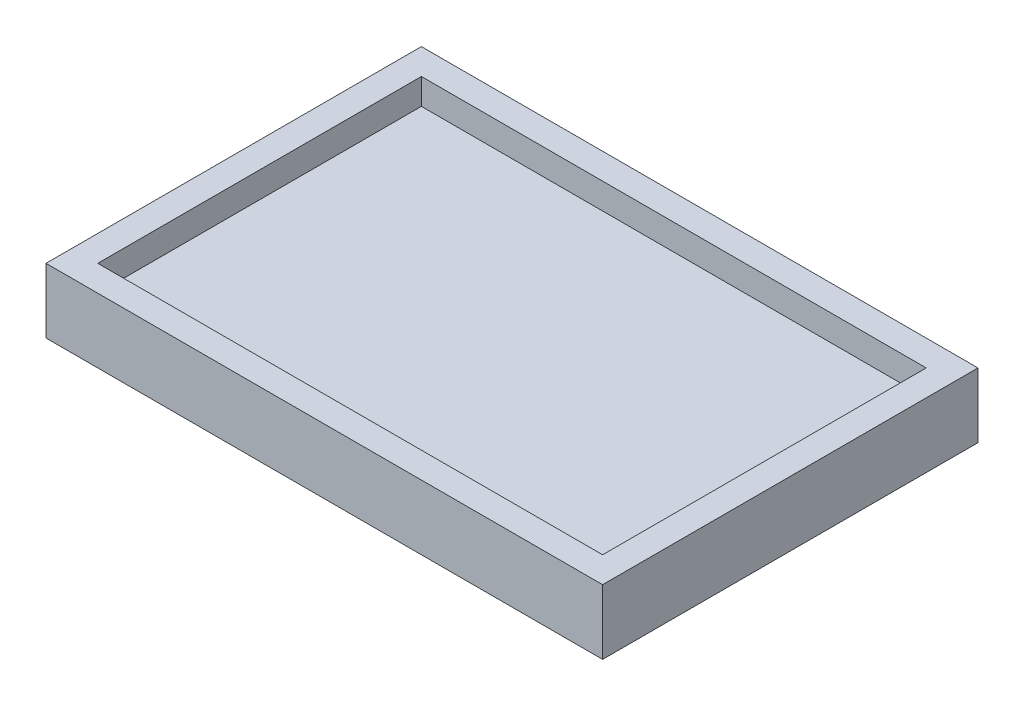
ISO-10303-21;
HEADER;
FILE_DESCRIPTION(('STEP AP214'),'2;1');
FILE_NAME('part.step','',(''),(''),'','','');
FILE_SCHEMA(('AUTOMOTIVE_DESIGN { 1 0 10303 214 1 1 1 1 }'));
ENDSEC;
DATA;
#1=APPLICATION_CONTEXT('core data for automotive mechanical design processes');
#2=APPLICATION_PROTOCOL_DEFINITION('international standard','automotive_design',2000,#1);
#3=PRODUCT_CONTEXT('',#1,'mechanical');
#4=PRODUCT('Part','Part','',(#3));
#5=PRODUCT_RELATED_PRODUCT_CATEGORY('part','',(#4));
#6=PRODUCT_DEFINITION_FORMATION('','',#4);
#7=PRODUCT_DEFINITION_CONTEXT('part definition',#1,'design');
#8=PRODUCT_DEFINITION('design','',#6,#7);
#9=PRODUCT_DEFINITION_SHAPE('','',#8);
#10=(LENGTH_UNIT() NAMED_UNIT(*) SI_UNIT(.MILLI.,.METRE.));
#11=(NAMED_UNIT(*) PLANE_ANGLE_UNIT() SI_UNIT($,.RADIAN.));
#12=(NAMED_UNIT(*) SI_UNIT($,.STERADIAN.) SOLID_ANGLE_UNIT());
#13=UNCERTAINTY_MEASURE_WITH_UNIT(LENGTH_MEASURE(1.E-05),#10,'distance_accuracy_value','');
#14=(GEOMETRIC_REPRESENTATION_CONTEXT(3) GLOBAL_UNCERTAINTY_ASSIGNED_CONTEXT((#13)) GLOBAL_UNIT_ASSIGNED_CONTEXT((#10,
#11,#12)) REPRESENTATION_CONTEXT('',''));
#15=CARTESIAN_POINT('',(0.,0.,0.));
#16=DIRECTION('',(0.,0.,1.));
#17=DIRECTION('',(1.,0.,0.));
#18=AXIS2_PLACEMENT_3D('',#15,#16,#17);
#19=CARTESIAN_POINT('',(-21.5,5.,-14.5));
#20=DIRECTION('',(1.,0.,0.));
#21=DIRECTION('',(0.,0.,-1.));
#22=AXIS2_PLACEMENT_3D('',#19,#20,#21);
#23=PLANE('',#22);
#24=DIRECTION('',(0.,0.,1.));
#25=VECTOR('',#24,1.);
#26=CARTESIAN_POINT('',(-21.5,0.,-14.5));
#27=LINE('',#26,#25);
#28=CARTESIAN_POINT('',(-21.5,0.,-14.5));
#29=VERTEX_POINT('',#28);
#30=CARTESIAN_POINT('',(-21.5,0.,14.5));
#31=VERTEX_POINT('',#30);
#32=EDGE_CURVE('E141',#29,#31,#27,.T.);
#33=ORIENTED_EDGE('',*,*,#32,.T.);
#34=DIRECTION('',(0.,-1.,0.));
#35=VECTOR('',#34,1.);
#36=CARTESIAN_POINT('',(-21.5,5.,14.5));
#37=LINE('',#36,#35);
#38=CARTESIAN_POINT('',(-21.5,5.,14.5));
#39=VERTEX_POINT('',#38);
#40=EDGE_CURVE('E11',#39,#31,#37,.T.);
#41=ORIENTED_EDGE('',*,*,#40,.F.);
#42=DIRECTION('',(0.,0.,1.));
#43=VECTOR('',#42,1.);
#44=CARTESIAN_POINT('',(-21.5,5.,-14.5));
#45=LINE('',#44,#43);
#46=CARTESIAN_POINT('',(-21.5,5.,-14.5));
#47=VERTEX_POINT('',#46);
#48=EDGE_CURVE('E145',#47,#39,#45,.T.);
#49=ORIENTED_EDGE('',*,*,#48,.F.);
#50=DIRECTION('',(0.,-1.,0.));
#51=VECTOR('',#50,1.);
#52=CARTESIAN_POINT('',(-21.5,5.,-14.5));
#53=LINE('',#52,#51);
#54=EDGE_CURVE('E151',#47,#29,#53,.T.);
#55=ORIENTED_EDGE('',*,*,#54,.T.);
#56=EDGE_LOOP('',(#33,#41,#49,#55));
#57=FACE_BOUND('',#56,.T.);
#58=ADVANCED_FACE('F33',(#57),#23,.F.);
#59=CARTESIAN_POINT('',(-21.5,5.,14.5));
#60=DIRECTION('',(0.,0.,-1.));
#61=DIRECTION('',(-1.,0.,0.));
#62=AXIS2_PLACEMENT_3D('',#59,#60,#61);
#63=PLANE('',#62);
#64=DIRECTION('',(1.,0.,0.));
#65=VECTOR('',#64,1.);
#66=CARTESIAN_POINT('',(-21.5,0.,14.5));
#67=LINE('',#66,#65);
#68=CARTESIAN_POINT('',(21.5,0.,14.5));
#69=VERTEX_POINT('',#68);
#70=EDGE_CURVE('E154',#31,#69,#67,.T.);
#71=ORIENTED_EDGE('',*,*,#70,.T.);
#72=DIRECTION('',(0.,-1.,0.));
#73=VECTOR('',#72,1.);
#74=CARTESIAN_POINT('',(21.5,5.,14.5));
#75=LINE('',#74,#73);
#76=CARTESIAN_POINT('',(21.5,5.,14.5));
#77=VERTEX_POINT('',#76);
#78=EDGE_CURVE('E40',#77,#69,#75,.T.);
#79=ORIENTED_EDGE('',*,*,#78,.F.);
#80=DIRECTION('',(1.,0.,0.));
#81=VECTOR('',#80,1.);
#82=CARTESIAN_POINT('',(-21.5,5.,14.5));
#83=LINE('',#82,#81);
#84=EDGE_CURVE('E84',#39,#77,#83,.T.);
#85=ORIENTED_EDGE('',*,*,#84,.F.);
#86=ORIENTED_EDGE('',*,*,#40,.T.);
#87=EDGE_LOOP('',(#71,#79,#85,#86));
#88=FACE_BOUND('',#87,.T.);
#89=ADVANCED_FACE('F183',(#88),#63,.F.);
#90=CARTESIAN_POINT('',(21.5,5.,-14.5));
#91=DIRECTION('',(-1.,0.,0.));
#92=DIRECTION('',(0.,0.,1.));
#93=AXIS2_PLACEMENT_3D('',#90,#91,#92);
#94=PLANE('',#93);
#95=DIRECTION('',(0.,0.,-1.));
#96=VECTOR('',#95,1.);
#97=CARTESIAN_POINT('',(21.5,0.,-14.5));
#98=LINE('',#97,#96);
#99=CARTESIAN_POINT('',(21.5,0.,-14.5));
#100=VERTEX_POINT('',#99);
#101=EDGE_CURVE('E156',#69,#100,#98,.T.);
#102=ORIENTED_EDGE('',*,*,#101,.T.);
#103=DIRECTION('',(0.,-1.,0.));
#104=VECTOR('',#103,1.);
#105=CARTESIAN_POINT('',(21.5,5.,-14.5));
#106=LINE('',#105,#104);
#107=CARTESIAN_POINT('',(21.5,5.,-14.5));
#108=VERTEX_POINT('',#107);
#109=EDGE_CURVE('E160',#108,#100,#106,.T.);
#110=ORIENTED_EDGE('',*,*,#109,.F.);
#111=DIRECTION('',(0.,0.,-1.));
#112=VECTOR('',#111,1.);
#113=CARTESIAN_POINT('',(21.5,5.,-14.5));
#114=LINE('',#113,#112);
#115=EDGE_CURVE('E148',#77,#108,#114,.T.);
#116=ORIENTED_EDGE('',*,*,#115,.F.);
#117=ORIENTED_EDGE('',*,*,#78,.T.);
#118=EDGE_LOOP('',(#102,#110,#116,#117));
#119=FACE_BOUND('',#118,.T.);
#120=ADVANCED_FACE('F165',(#119),#94,.F.);
#121=CARTESIAN_POINT('',(-21.5,5.,-14.5));
#122=DIRECTION('',(0.,0.,1.));
#123=DIRECTION('',(1.,0.,0.));
#124=AXIS2_PLACEMENT_3D('',#121,#122,#123);
#125=PLANE('',#124);
#126=DIRECTION('',(-1.,0.,0.));
#127=VECTOR('',#126,1.);
#128=CARTESIAN_POINT('',(-21.5,0.,-14.5));
#129=LINE('',#128,#127);
#130=EDGE_CURVE('E77',#100,#29,#129,.T.);
#131=ORIENTED_EDGE('',*,*,#130,.T.);
#132=ORIENTED_EDGE('',*,*,#54,.F.);
#133=DIRECTION('',(-1.,0.,0.));
#134=VECTOR('',#133,1.);
#135=CARTESIAN_POINT('',(-21.5,5.,-14.5));
#136=LINE('',#135,#134);
#137=EDGE_CURVE('E56',#108,#47,#136,.T.);
#138=ORIENTED_EDGE('',*,*,#137,.F.);
#139=ORIENTED_EDGE('',*,*,#109,.T.);
#140=EDGE_LOOP('',(#131,#132,#138,#139));
#141=FACE_BOUND('',#140,.T.);
#142=ADVANCED_FACE('F173',(#141),#125,.F.);
#143=CARTESIAN_POINT('',(0.,5.,0.));
#144=DIRECTION('',(0.,1.,0.));
#145=DIRECTION('',(0.,0.,1.));
#146=AXIS2_PLACEMENT_3D('',#143,#144,#145);
#147=PLANE('',#146);
#148=DIRECTION('',(-1.,0.,0.));
#149=VECTOR('',#148,1.);
#150=CARTESIAN_POINT('',(19.5,5.,-12.5));
#151=LINE('',#150,#149);
#152=CARTESIAN_POINT('',(19.5,5.,-12.5));
#153=VERTEX_POINT('',#152);
#154=CARTESIAN_POINT('',(-19.5,5.,-12.5));
#155=VERTEX_POINT('',#154);
#156=EDGE_CURVE('E47',#153,#155,#151,.T.);
#157=ORIENTED_EDGE('',*,*,#156,.F.);
#158=DIRECTION('',(0.,0.,-1.));
#159=VECTOR('',#158,1.);
#160=CARTESIAN_POINT('',(19.5,5.,12.5));
#161=LINE('',#160,#159);
#162=CARTESIAN_POINT('',(19.5,5.,12.5));
#163=VERTEX_POINT('',#162);
#164=EDGE_CURVE('E126',#163,#153,#161,.T.);
#165=ORIENTED_EDGE('',*,*,#164,.F.);
#166=DIRECTION('',(1.,0.,0.));
#167=VECTOR('',#166,1.);
#168=CARTESIAN_POINT('',(-19.5,5.,12.5));
#169=LINE('',#168,#167);
#170=CARTESIAN_POINT('',(-19.5,5.,12.5));
#171=VERTEX_POINT('',#170);
#172=EDGE_CURVE('E129',#171,#163,#169,.T.);
#173=ORIENTED_EDGE('',*,*,#172,.F.);
#174=DIRECTION('',(0.,0.,1.));
#175=VECTOR('',#174,1.);
#176=CARTESIAN_POINT('',(-19.5,5.,-12.5));
#177=LINE('',#176,#175);
#178=EDGE_CURVE('E135',#155,#171,#177,.T.);
#179=ORIENTED_EDGE('',*,*,#178,.F.);
#180=EDGE_LOOP('',(#157,#165,#173,#179));
#181=FACE_BOUND('',#180,.T.);
#182=ORIENTED_EDGE('',*,*,#48,.T.);
#183=ORIENTED_EDGE('',*,*,#84,.T.);
#184=ORIENTED_EDGE('',*,*,#115,.T.);
#185=ORIENTED_EDGE('',*,*,#137,.T.);
#186=EDGE_LOOP('',(#182,#183,#184,#185));
#187=FACE_BOUND('',#186,.T.);
#188=ADVANCED_FACE('F175',(#181,#187),#147,.T.);
#189=CARTESIAN_POINT('',(0.,0.,0.));
#190=DIRECTION('',(0.,1.,0.));
#191=DIRECTION('',(0.,0.,1.));
#192=AXIS2_PLACEMENT_3D('',#189,#190,#191);
#193=PLANE('',#192);
#194=ORIENTED_EDGE('',*,*,#32,.F.);
#195=ORIENTED_EDGE('',*,*,#130,.F.);
#196=ORIENTED_EDGE('',*,*,#101,.F.);
#197=ORIENTED_EDGE('',*,*,#70,.F.);
#198=EDGE_LOOP('',(#194,#195,#196,#197));
#199=FACE_BOUND('',#198,.T.);
#200=ADVANCED_FACE('F169',(#199),#193,.F.);
#201=CARTESIAN_POINT('',(19.5,3.,-12.5));
#202=DIRECTION('',(0.,0.,-1.));
#203=DIRECTION('',(-1.,0.,0.));
#204=AXIS2_PLACEMENT_3D('',#201,#202,#203);
#205=PLANE('',#204);
#206=ORIENTED_EDGE('',*,*,#156,.T.);
#207=DIRECTION('',(0.,1.,0.));
#208=VECTOR('',#207,1.);
#209=CARTESIAN_POINT('',(-19.5,3.,-12.5));
#210=LINE('',#209,#208);
#211=CARTESIAN_POINT('',(-19.5,3.,-12.5));
#212=VERTEX_POINT('',#211);
#213=EDGE_CURVE('E104',#212,#155,#210,.T.);
#214=ORIENTED_EDGE('',*,*,#213,.F.);
#215=DIRECTION('',(-1.,0.,0.));
#216=VECTOR('',#215,1.);
#217=CARTESIAN_POINT('',(19.5,3.,-12.5));
#218=LINE('',#217,#216);
#219=CARTESIAN_POINT('',(19.5,3.,-12.5));
#220=VERTEX_POINT('',#219);
#221=EDGE_CURVE('E108',#220,#212,#218,.T.);
#222=ORIENTED_EDGE('',*,*,#221,.F.);
#223=DIRECTION('',(0.,1.,0.));
#224=VECTOR('',#223,1.);
#225=CARTESIAN_POINT('',(19.5,3.,-12.5));
#226=LINE('',#225,#224);
#227=EDGE_CURVE('E139',#220,#153,#226,.T.);
#228=ORIENTED_EDGE('',*,*,#227,.T.);
#229=EDGE_LOOP('',(#206,#214,#222,#228));
#230=FACE_BOUND('',#229,.T.);
#231=ADVANCED_FACE('F106',(#230),#205,.F.);
#232=CARTESIAN_POINT('',(19.5,3.,12.5));
#233=DIRECTION('',(1.,0.,0.));
#234=DIRECTION('',(0.,0.,-1.));
#235=AXIS2_PLACEMENT_3D('',#232,#233,#234);
#236=PLANE('',#235);
#237=ORIENTED_EDGE('',*,*,#164,.T.);
#238=ORIENTED_EDGE('',*,*,#227,.F.);
#239=DIRECTION('',(0.,0.,-1.));
#240=VECTOR('',#239,1.);
#241=CARTESIAN_POINT('',(19.5,3.,12.5));
#242=LINE('',#241,#240);
#243=CARTESIAN_POINT('',(19.5,3.,12.5));
#244=VERTEX_POINT('',#243);
#245=EDGE_CURVE('E114',#244,#220,#242,.T.);
#246=ORIENTED_EDGE('',*,*,#245,.F.);
#247=DIRECTION('',(0.,1.,0.));
#248=VECTOR('',#247,1.);
#249=CARTESIAN_POINT('',(19.5,3.,12.5));
#250=LINE('',#249,#248);
#251=EDGE_CURVE('E142',#244,#163,#250,.T.);
#252=ORIENTED_EDGE('',*,*,#251,.T.);
#253=EDGE_LOOP('',(#237,#238,#246,#252));
#254=FACE_BOUND('',#253,.T.);
#255=ADVANCED_FACE('F222',(#254),#236,.F.);
#256=CARTESIAN_POINT('',(-19.5,3.,12.5));
#257=DIRECTION('',(0.,0.,1.));
#258=DIRECTION('',(1.,0.,0.));
#259=AXIS2_PLACEMENT_3D('',#256,#257,#258);
#260=PLANE('',#259);
#261=ORIENTED_EDGE('',*,*,#172,.T.);
#262=ORIENTED_EDGE('',*,*,#251,.F.);
#263=DIRECTION('',(1.,0.,0.));
#264=VECTOR('',#263,1.);
#265=CARTESIAN_POINT('',(-19.5,3.,12.5));
#266=LINE('',#265,#264);
#267=CARTESIAN_POINT('',(-19.5,3.,12.5));
#268=VERTEX_POINT('',#267);
#269=EDGE_CURVE('E122',#268,#244,#266,.T.);
#270=ORIENTED_EDGE('',*,*,#269,.F.);
#271=DIRECTION('',(0.,1.,0.));
#272=VECTOR('',#271,1.);
#273=CARTESIAN_POINT('',(-19.5,3.,12.5));
#274=LINE('',#273,#272);
#275=EDGE_CURVE('E113',#268,#171,#274,.T.);
#276=ORIENTED_EDGE('',*,*,#275,.T.);
#277=EDGE_LOOP('',(#261,#262,#270,#276));
#278=FACE_BOUND('',#277,.T.);
#279=ADVANCED_FACE('F231',(#278),#260,.F.);
#280=CARTESIAN_POINT('',(-19.5,3.,-12.5));
#281=DIRECTION('',(-1.,0.,0.));
#282=DIRECTION('',(0.,0.,1.));
#283=AXIS2_PLACEMENT_3D('',#280,#281,#282);
#284=PLANE('',#283);
#285=ORIENTED_EDGE('',*,*,#178,.T.);
#286=ORIENTED_EDGE('',*,*,#275,.F.);
#287=DIRECTION('',(0.,0.,1.));
#288=VECTOR('',#287,1.);
#289=CARTESIAN_POINT('',(-19.5,3.,-12.5));
#290=LINE('',#289,#288);
#291=EDGE_CURVE('E117',#212,#268,#290,.T.);
#292=ORIENTED_EDGE('',*,*,#291,.F.);
#293=ORIENTED_EDGE('',*,*,#213,.T.);
#294=EDGE_LOOP('',(#285,#286,#292,#293));
#295=FACE_BOUND('',#294,.T.);
#296=ADVANCED_FACE('F118',(#295),#284,.F.);
#297=CARTESIAN_POINT('',(0.,3.,0.));
#298=DIRECTION('',(0.,1.,0.));
#299=DIRECTION('',(0.,0.,1.));
#300=AXIS2_PLACEMENT_3D('',#297,#298,#299);
#301=PLANE('',#300);
#302=ORIENTED_EDGE('',*,*,#221,.T.);
#303=ORIENTED_EDGE('',*,*,#291,.T.);
#304=ORIENTED_EDGE('',*,*,#269,.T.);
#305=ORIENTED_EDGE('',*,*,#245,.T.);
#306=EDGE_LOOP('',(#302,#303,#304,#305));
#307=FACE_BOUND('',#306,.T.);
#308=ADVANCED_FACE('F124',(#307),#301,.T.);
#309=CLOSED_SHELL('',(#58,#89,#120,#142,#188,#200,#231,#255,#279,#296,#308));
#310=MANIFOLD_SOLID_BREP('B2',#309);
#311=ADVANCED_BREP_SHAPE_REPRESENTATION('',(#18,#310),#14);
#312=SHAPE_DEFINITION_REPRESENTATION(#9,#311);
ENDSEC;
END-ISO-10303-21;
